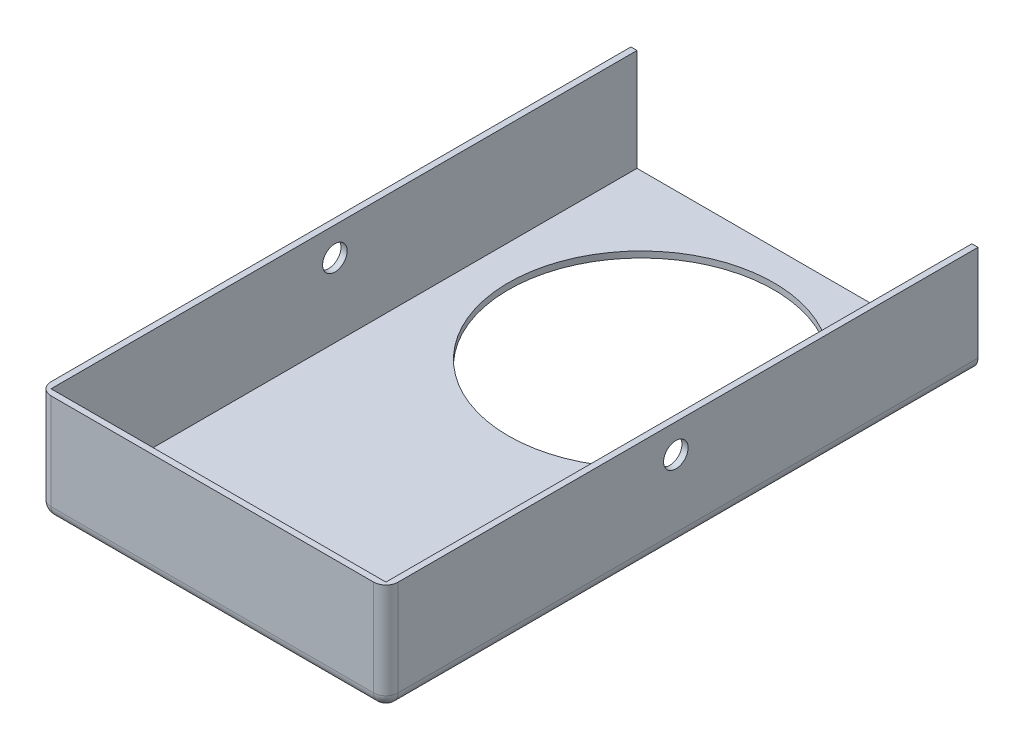
ISO-10303-21;
HEADER;
FILE_DESCRIPTION(('STEP AP214'),'2;1');
FILE_NAME('part.step','',(''),(''),'','','');
FILE_SCHEMA(('AUTOMOTIVE_DESIGN { 1 0 10303 214 1 1 1 1 }'));
ENDSEC;
DATA;
#1=APPLICATION_CONTEXT('core data for automotive mechanical design processes');
#2=APPLICATION_PROTOCOL_DEFINITION('international standard','automotive_design',2000,#1);
#3=PRODUCT_CONTEXT('',#1,'mechanical');
#4=PRODUCT('Part','Part','',(#3));
#5=PRODUCT_RELATED_PRODUCT_CATEGORY('part','',(#4));
#6=PRODUCT_DEFINITION_FORMATION('','',#4);
#7=PRODUCT_DEFINITION_CONTEXT('part definition',#1,'design');
#8=PRODUCT_DEFINITION('design','',#6,#7);
#9=PRODUCT_DEFINITION_SHAPE('','',#8);
#10=(LENGTH_UNIT() NAMED_UNIT(*) SI_UNIT(.MILLI.,.METRE.));
#11=(NAMED_UNIT(*) PLANE_ANGLE_UNIT() SI_UNIT($,.RADIAN.));
#12=(NAMED_UNIT(*) SI_UNIT($,.STERADIAN.) SOLID_ANGLE_UNIT());
#13=UNCERTAINTY_MEASURE_WITH_UNIT(LENGTH_MEASURE(1.E-05),#10,'distance_accuracy_value','');
#14=(GEOMETRIC_REPRESENTATION_CONTEXT(3) GLOBAL_UNCERTAINTY_ASSIGNED_CONTEXT((#13)) GLOBAL_UNIT_ASSIGNED_CONTEXT((#10,
#11,#12)) REPRESENTATION_CONTEXT('',''));
#15=CARTESIAN_POINT('',(0.,0.,0.));
#16=DIRECTION('',(0.,0.,1.));
#17=DIRECTION('',(1.,0.,0.));
#18=AXIS2_PLACEMENT_3D('',#15,#16,#17);
#19=CARTESIAN_POINT('',(0.,1.5,0.));
#20=DIRECTION('',(0.,1.,0.));
#21=DIRECTION('',(0.,0.,1.));
#22=AXIS2_PLACEMENT_3D('',#19,#20,#21);
#23=PLANE('',#22);
#24=CARTESIAN_POINT('',(0.,1.5,54.5));
#25=DIRECTION('',(0.,1.,0.));
#26=DIRECTION('',(0.,0.,1.));
#27=AXIS2_PLACEMENT_3D('',#24,#25,#26);
#28=CIRCLE('',#27,4.5);
#29=CARTESIAN_POINT('',(0.,1.5,59.));
#30=VERTEX_POINT('',#29);
#31=EDGE_CURVE('E11',#30,#30,#28,.F.);
#32=ORIENTED_EDGE('',*,*,#31,.T.);
#33=EDGE_LOOP('',(#32));
#34=FACE_BOUND('',#33,.T.);
#35=CARTESIAN_POINT('',(0.,1.5,-32.5));
#36=DIRECTION('',(0.,1.,0.));
#37=DIRECTION('',(0.,0.,1.));
#38=AXIS2_PLACEMENT_3D('',#35,#36,#37);
#39=CIRCLE('',#38,32.5);
#40=CARTESIAN_POINT('',(0.,1.5,0.));
#41=VERTEX_POINT('',#40);
#42=EDGE_CURVE('E216',#41,#41,#39,.T.);
#43=ORIENTED_EDGE('',*,*,#42,.F.);
#44=EDGE_LOOP('',(#43));
#45=FACE_BOUND('',#44,.T.);
#46=DIRECTION('',(0.,0.,-1.));
#47=VECTOR('',#46,1.);
#48=CARTESIAN_POINT('',(-41.,1.5,0.));
#49=LINE('',#48,#47);
#50=CARTESIAN_POINT('',(-41.,1.5,71.));
#51=VERTEX_POINT('',#50);
#52=CARTESIAN_POINT('',(-41.,1.5,-72.5));
#53=VERTEX_POINT('',#52);
#54=EDGE_CURVE('E197',#51,#53,#49,.T.);
#55=ORIENTED_EDGE('',*,*,#54,.F.);
#56=DIRECTION('',(1.,0.,0.));
#57=VECTOR('',#56,1.);
#58=CARTESIAN_POINT('',(0.,1.5,71.));
#59=LINE('',#58,#57);
#60=CARTESIAN_POINT('',(41.,1.5,71.));
#61=VERTEX_POINT('',#60);
#62=EDGE_CURVE('E192',#51,#61,#59,.T.);
#63=ORIENTED_EDGE('',*,*,#62,.T.);
#64=DIRECTION('',(0.,0.,-1.));
#65=VECTOR('',#64,1.);
#66=CARTESIAN_POINT('',(41.,1.5,0.));
#67=LINE('',#66,#65);
#68=CARTESIAN_POINT('',(41.,1.5,-72.5));
#69=VERTEX_POINT('',#68);
#70=EDGE_CURVE('E188',#61,#69,#67,.T.);
#71=ORIENTED_EDGE('',*,*,#70,.T.);
#72=DIRECTION('',(-1.,0.,0.));
#73=VECTOR('',#72,1.);
#74=CARTESIAN_POINT('',(42.5,1.5,-72.5));
#75=LINE('',#74,#73);
#76=EDGE_CURVE('E224',#69,#53,#75,.T.);
#77=ORIENTED_EDGE('',*,*,#76,.T.);
#78=EDGE_LOOP('',(#55,#63,#71,#77));
#79=FACE_BOUND('',#78,.T.);
#80=ADVANCED_FACE('F45',(#34,#45,#79),#23,.T.);
#81=CARTESIAN_POINT('',(0.,0.,0.));
#82=DIRECTION('',(0.,1.,0.));
#83=DIRECTION('',(0.,0.,1.));
#84=AXIS2_PLACEMENT_3D('',#81,#82,#83);
#85=PLANE('',#84);
#86=DIRECTION('',(1.,0.,0.));
#87=VECTOR('',#86,1.);
#88=CARTESIAN_POINT('',(0.,0.,69.5));
#89=LINE('',#88,#87);
#90=CARTESIAN_POINT('',(39.5,0.,69.5));
#91=VERTEX_POINT('',#90);
#92=CARTESIAN_POINT('',(-39.5,0.,69.5));
#93=VERTEX_POINT('',#92);
#94=EDGE_CURVE('E61',#91,#93,#89,.F.);
#95=ORIENTED_EDGE('',*,*,#94,.T.);
#96=DIRECTION('',(0.,0.,1.));
#97=VECTOR('',#96,1.);
#98=CARTESIAN_POINT('',(-39.5,0.,0.));
#99=LINE('',#98,#97);
#100=CARTESIAN_POINT('',(-39.5,0.,-72.5));
#101=VERTEX_POINT('',#100);
#102=EDGE_CURVE('E267',#93,#101,#99,.F.);
#103=ORIENTED_EDGE('',*,*,#102,.T.);
#104=DIRECTION('',(-1.,0.,0.));
#105=VECTOR('',#104,1.);
#106=CARTESIAN_POINT('',(42.5,0.,-72.5));
#107=LINE('',#106,#105);
#108=CARTESIAN_POINT('',(39.5,0.,-72.5));
#109=VERTEX_POINT('',#108);
#110=EDGE_CURVE('E220',#109,#101,#107,.T.);
#111=ORIENTED_EDGE('',*,*,#110,.F.);
#112=DIRECTION('',(0.,0.,-1.));
#113=VECTOR('',#112,1.);
#114=CARTESIAN_POINT('',(39.5,0.,0.));
#115=LINE('',#114,#113);
#116=EDGE_CURVE('E66',#109,#91,#115,.F.);
#117=ORIENTED_EDGE('',*,*,#116,.T.);
#118=EDGE_LOOP('',(#95,#103,#111,#117));
#119=FACE_BOUND('',#118,.T.);
#120=CARTESIAN_POINT('',(0.,0.,-32.5));
#121=DIRECTION('',(0.,1.,0.));
#122=DIRECTION('',(0.,0.,1.));
#123=AXIS2_PLACEMENT_3D('',#120,#121,#122);
#124=CIRCLE('',#123,32.5);
#125=CARTESIAN_POINT('',(0.,0.,0.));
#126=VERTEX_POINT('',#125);
#127=EDGE_CURVE('E215',#126,#126,#124,.T.);
#128=ORIENTED_EDGE('',*,*,#127,.T.);
#129=EDGE_LOOP('',(#128));
#130=FACE_BOUND('',#129,.T.);
#131=CARTESIAN_POINT('',(0.,0.,54.5));
#132=DIRECTION('',(0.,1.,0.));
#133=DIRECTION('',(0.,0.,1.));
#134=AXIS2_PLACEMENT_3D('',#131,#132,#133);
#135=CIRCLE('',#134,3.);
#136=CARTESIAN_POINT('',(0.,0.,57.5));
#137=VERTEX_POINT('',#136);
#138=EDGE_CURVE('E211',#137,#137,#135,.T.);
#139=ORIENTED_EDGE('',*,*,#138,.T.);
#140=EDGE_LOOP('',(#139));
#141=FACE_BOUND('',#140,.T.);
#142=ADVANCED_FACE('F316',(#119,#130,#141),#85,.F.);
#143=CARTESIAN_POINT('',(-42.5,1.5,72.5));
#144=DIRECTION('',(1.,0.,0.));
#145=DIRECTION('',(0.,0.,-1.));
#146=AXIS2_PLACEMENT_3D('',#143,#144,#145);
#147=PLANE('',#146);
#148=CARTESIAN_POINT('',(-42.5,19.5,1.50000000000002));
#149=DIRECTION('',(1.,0.,0.));
#150=DIRECTION('',(0.,0.,-1.));
#151=AXIS2_PLACEMENT_3D('',#148,#149,#150);
#152=CIRCLE('',#151,3.);
#153=CARTESIAN_POINT('',(-42.5,19.5,-1.49999999999998));
#154=VERTEX_POINT('',#153);
#155=EDGE_CURVE('E237',#154,#154,#152,.T.);
#156=ORIENTED_EDGE('',*,*,#155,.T.);
#157=EDGE_LOOP('',(#156));
#158=FACE_BOUND('',#157,.T.);
#159=DIRECTION('',(0.,0.,1.));
#160=VECTOR('',#159,1.);
#161=CARTESIAN_POINT('',(-42.5,3.,72.5));
#162=LINE('',#161,#160);
#163=CARTESIAN_POINT('',(-42.5,3.,-72.5));
#164=VERTEX_POINT('',#163);
#165=CARTESIAN_POINT('',(-42.5,3.,69.5));
#166=VERTEX_POINT('',#165);
#167=EDGE_CURVE('E257',#164,#166,#162,.T.);
#168=ORIENTED_EDGE('',*,*,#167,.T.);
#169=DIRECTION('',(0.,-1.,0.));
#170=VECTOR('',#169,1.);
#171=CARTESIAN_POINT('',(-42.5,1.5,69.5));
#172=LINE('',#171,#170);
#173=CARTESIAN_POINT('',(-42.5,26.5,69.5));
#174=VERTEX_POINT('',#173);
#175=EDGE_CURVE('E260',#166,#174,#172,.F.);
#176=ORIENTED_EDGE('',*,*,#175,.T.);
#177=DIRECTION('',(0.,0.,1.));
#178=VECTOR('',#177,1.);
#179=CARTESIAN_POINT('',(-42.5,26.5,0.));
#180=LINE('',#179,#178);
#181=CARTESIAN_POINT('',(-42.5,26.5,-72.5));
#182=VERTEX_POINT('',#181);
#183=EDGE_CURVE('E183',#182,#174,#180,.T.);
#184=ORIENTED_EDGE('',*,*,#183,.F.);
#185=DIRECTION('',(0.,-1.,0.));
#186=VECTOR('',#185,1.);
#187=CARTESIAN_POINT('',(-42.5,1.5,-72.5));
#188=LINE('',#187,#186);
#189=EDGE_CURVE('E157',#182,#164,#188,.T.);
#190=ORIENTED_EDGE('',*,*,#189,.T.);
#191=EDGE_LOOP('',(#168,#176,#184,#190));
#192=FACE_BOUND('',#191,.T.);
#193=ADVANCED_FACE('F324',(#158,#192),#147,.F.);
#194=CARTESIAN_POINT('',(42.5,1.5,72.5));
#195=DIRECTION('',(0.,0.,-1.));
#196=DIRECTION('',(-1.,0.,0.));
#197=AXIS2_PLACEMENT_3D('',#194,#195,#196);
#198=PLANE('',#197);
#199=DIRECTION('',(1.,0.,0.));
#200=VECTOR('',#199,1.);
#201=CARTESIAN_POINT('',(42.5,3.,72.5));
#202=LINE('',#201,#200);
#203=CARTESIAN_POINT('',(-39.5,3.,72.5));
#204=VERTEX_POINT('',#203);
#205=CARTESIAN_POINT('',(39.5,3.,72.5));
#206=VERTEX_POINT('',#205);
#207=EDGE_CURVE('E243',#204,#206,#202,.T.);
#208=ORIENTED_EDGE('',*,*,#207,.T.);
#209=DIRECTION('',(0.,-1.,0.));
#210=VECTOR('',#209,1.);
#211=CARTESIAN_POINT('',(39.5,1.5,72.5));
#212=LINE('',#211,#210);
#213=CARTESIAN_POINT('',(39.5,26.5,72.5));
#214=VERTEX_POINT('',#213);
#215=EDGE_CURVE('E249',#206,#214,#212,.F.);
#216=ORIENTED_EDGE('',*,*,#215,.T.);
#217=DIRECTION('',(1.,0.,0.));
#218=VECTOR('',#217,1.);
#219=CARTESIAN_POINT('',(0.,26.5,72.5));
#220=LINE('',#219,#218);
#221=CARTESIAN_POINT('',(-39.5,26.5,72.5));
#222=VERTEX_POINT('',#221);
#223=EDGE_CURVE('E147',#222,#214,#220,.T.);
#224=ORIENTED_EDGE('',*,*,#223,.F.);
#225=DIRECTION('',(0.,-1.,0.));
#226=VECTOR('',#225,1.);
#227=CARTESIAN_POINT('',(-39.5,1.5,72.5));
#228=LINE('',#227,#226);
#229=EDGE_CURVE('E246',#222,#204,#228,.T.);
#230=ORIENTED_EDGE('',*,*,#229,.T.);
#231=EDGE_LOOP('',(#208,#216,#224,#230));
#232=FACE_BOUND('',#231,.T.);
#233=ADVANCED_FACE('F335',(#232),#198,.F.);
#234=CARTESIAN_POINT('',(42.5,1.5,72.5));
#235=DIRECTION('',(-1.,0.,0.));
#236=DIRECTION('',(0.,0.,1.));
#237=AXIS2_PLACEMENT_3D('',#234,#235,#236);
#238=PLANE('',#237);
#239=CARTESIAN_POINT('',(42.5,19.5,1.50000000000002));
#240=DIRECTION('',(1.,0.,0.));
#241=DIRECTION('',(0.,0.,-1.));
#242=AXIS2_PLACEMENT_3D('',#239,#240,#241);
#243=CIRCLE('',#242,3.);
#244=CARTESIAN_POINT('',(42.5,19.5,-1.49999999999998));
#245=VERTEX_POINT('',#244);
#246=EDGE_CURVE('E299',#245,#245,#243,.T.);
#247=ORIENTED_EDGE('',*,*,#246,.F.);
#248=EDGE_LOOP('',(#247));
#249=FACE_BOUND('',#248,.T.);
#250=DIRECTION('',(0.,0.,-1.));
#251=VECTOR('',#250,1.);
#252=CARTESIAN_POINT('',(42.5,26.5,0.));
#253=LINE('',#252,#251);
#254=CARTESIAN_POINT('',(42.5,26.5,69.5));
#255=VERTEX_POINT('',#254);
#256=CARTESIAN_POINT('',(42.5,26.5,-72.5));
#257=VERTEX_POINT('',#256);
#258=EDGE_CURVE('E133',#255,#257,#253,.T.);
#259=ORIENTED_EDGE('',*,*,#258,.F.);
#260=DIRECTION('',(0.,-1.,0.));
#261=VECTOR('',#260,1.);
#262=CARTESIAN_POINT('',(42.5,1.5,69.5));
#263=LINE('',#262,#261);
#264=CARTESIAN_POINT('',(42.5,3.,69.5));
#265=VERTEX_POINT('',#264);
#266=EDGE_CURVE('E240',#255,#265,#263,.T.);
#267=ORIENTED_EDGE('',*,*,#266,.T.);
#268=DIRECTION('',(0.,0.,-1.));
#269=VECTOR('',#268,1.);
#270=CARTESIAN_POINT('',(42.5,3.,72.5));
#271=LINE('',#270,#269);
#272=CARTESIAN_POINT('',(42.5,3.,-72.5));
#273=VERTEX_POINT('',#272);
#274=EDGE_CURVE('E153',#265,#273,#271,.T.);
#275=ORIENTED_EDGE('',*,*,#274,.T.);
#276=DIRECTION('',(0.,-1.,0.));
#277=VECTOR('',#276,1.);
#278=CARTESIAN_POINT('',(42.5,1.5,-72.5));
#279=LINE('',#278,#277);
#280=EDGE_CURVE('E150',#257,#273,#279,.T.);
#281=ORIENTED_EDGE('',*,*,#280,.F.);
#282=EDGE_LOOP('',(#259,#267,#275,#281));
#283=FACE_BOUND('',#282,.T.);
#284=ADVANCED_FACE('F151',(#249,#283),#238,.F.);
#285=CARTESIAN_POINT('',(42.5,1.5,-72.5));
#286=DIRECTION('',(0.,0.,1.));
#287=DIRECTION('',(1.,0.,0.));
#288=AXIS2_PLACEMENT_3D('',#285,#286,#287);
#289=PLANE('',#288);
#290=ORIENTED_EDGE('',*,*,#110,.T.);
#291=CARTESIAN_POINT('',(-39.5,3.,-72.5));
#292=DIRECTION('',(0.,0.,1.));
#293=DIRECTION('',(1.,0.,0.));
#294=AXIS2_PLACEMENT_3D('',#291,#292,#293);
#295=CIRCLE('',#294,3.);
#296=EDGE_CURVE('E273',#101,#164,#295,.F.);
#297=ORIENTED_EDGE('',*,*,#296,.T.);
#298=ORIENTED_EDGE('',*,*,#189,.F.);
#299=DIRECTION('',(-1.,0.,0.));
#300=VECTOR('',#299,1.);
#301=CARTESIAN_POINT('',(0.,26.5,-72.5));
#302=LINE('',#301,#300);
#303=CARTESIAN_POINT('',(-41.,26.5,-72.5));
#304=VERTEX_POINT('',#303);
#305=EDGE_CURVE('E179',#304,#182,#302,.T.);
#306=ORIENTED_EDGE('',*,*,#305,.F.);
#307=DIRECTION('',(0.,-1.,0.));
#308=VECTOR('',#307,1.);
#309=CARTESIAN_POINT('',(-41.,26.5,-72.5));
#310=LINE('',#309,#308);
#311=EDGE_CURVE('E187',#304,#53,#310,.T.);
#312=ORIENTED_EDGE('',*,*,#311,.T.);
#313=ORIENTED_EDGE('',*,*,#76,.F.);
#314=DIRECTION('',(0.,-1.,0.));
#315=VECTOR('',#314,1.);
#316=CARTESIAN_POINT('',(41.,26.5,-72.5));
#317=LINE('',#316,#315);
#318=CARTESIAN_POINT('',(41.,26.5,-72.5));
#319=VERTEX_POINT('',#318);
#320=EDGE_CURVE('E162',#319,#69,#317,.T.);
#321=ORIENTED_EDGE('',*,*,#320,.F.);
#322=DIRECTION('',(-1.,0.,0.));
#323=VECTOR('',#322,1.);
#324=CARTESIAN_POINT('',(0.,26.5,-72.5));
#325=LINE('',#324,#323);
#326=EDGE_CURVE('E139',#257,#319,#325,.T.);
#327=ORIENTED_EDGE('',*,*,#326,.F.);
#328=ORIENTED_EDGE('',*,*,#280,.T.);
#329=CARTESIAN_POINT('',(39.5,3.,-72.5));
#330=DIRECTION('',(0.,0.,1.));
#331=DIRECTION('',(1.,0.,0.));
#332=AXIS2_PLACEMENT_3D('',#329,#330,#331);
#333=CIRCLE('',#332,3.);
#334=EDGE_CURVE('E270',#273,#109,#333,.F.);
#335=ORIENTED_EDGE('',*,*,#334,.T.);
#336=EDGE_LOOP('',(#290,#297,#298,#306,#312,#313,#321,#327,#328,#335));
#337=FACE_BOUND('',#336,.T.);
#338=ADVANCED_FACE('F160',(#337),#289,.F.);
#339=CARTESIAN_POINT('',(0.,1.5,-32.5));
#340=DIRECTION('',(0.,-1.,0.));
#341=DIRECTION('',(0.,0.,-1.));
#342=AXIS2_PLACEMENT_3D('',#339,#340,#341);
#343=CYLINDRICAL_SURFACE('',#342,32.5);
#344=ORIENTED_EDGE('',*,*,#42,.T.);
#345=EDGE_LOOP('',(#344));
#346=FACE_BOUND('',#345,.T.);
#347=ORIENTED_EDGE('',*,*,#127,.F.);
#348=EDGE_LOOP('',(#347));
#349=FACE_BOUND('',#348,.T.);
#350=ADVANCED_FACE('F328',(#346,#349),#343,.F.);
#351=CARTESIAN_POINT('',(0.,1.5,54.5));
#352=DIRECTION('',(0.,-1.,0.));
#353=DIRECTION('',(0.,0.,-1.));
#354=AXIS2_PLACEMENT_3D('',#351,#352,#353);
#355=CYLINDRICAL_SURFACE('',#354,3.);
#356=ORIENTED_EDGE('',*,*,#138,.F.);
#357=EDGE_LOOP('',(#356));
#358=FACE_BOUND('',#357,.T.);
#359=CARTESIAN_POINT('',(0.,4.5,54.5));
#360=DIRECTION('',(0.,1.,0.));
#361=DIRECTION('',(0.,0.,1.));
#362=AXIS2_PLACEMENT_3D('',#359,#360,#361);
#363=CIRCLE('',#362,3.);
#364=CARTESIAN_POINT('',(0.,4.5,57.5));
#365=VERTEX_POINT('',#364);
#366=EDGE_CURVE('E406',#365,#365,#363,.T.);
#367=ORIENTED_EDGE('',*,*,#366,.T.);
#368=EDGE_LOOP('',(#367));
#369=FACE_BOUND('',#368,.T.);
#370=ADVANCED_FACE('F411',(#358,#369),#355,.F.);
#371=CARTESIAN_POINT('',(41.,26.5,0.));
#372=DIRECTION('',(-1.,0.,0.));
#373=DIRECTION('',(0.,0.,1.));
#374=AXIS2_PLACEMENT_3D('',#371,#372,#373);
#375=PLANE('',#374);
#376=CARTESIAN_POINT('',(41.,19.5,1.50000000000002));
#377=DIRECTION('',(-1.,0.,0.));
#378=DIRECTION('',(0.,0.,1.));
#379=AXIS2_PLACEMENT_3D('',#376,#377,#378);
#380=CIRCLE('',#379,3.);
#381=CARTESIAN_POINT('',(41.,19.5,4.50000000000001));
#382=VERTEX_POINT('',#381);
#383=EDGE_CURVE('E193',#382,#382,#380,.T.);
#384=ORIENTED_EDGE('',*,*,#383,.F.);
#385=EDGE_LOOP('',(#384));
#386=FACE_BOUND('',#385,.T.);
#387=ORIENTED_EDGE('',*,*,#70,.F.);
#388=DIRECTION('',(0.,-1.,0.));
#389=VECTOR('',#388,1.);
#390=CARTESIAN_POINT('',(41.,26.5,71.));
#391=LINE('',#390,#389);
#392=CARTESIAN_POINT('',(41.,26.5,71.));
#393=VERTEX_POINT('',#392);
#394=EDGE_CURVE('E206',#393,#61,#391,.T.);
#395=ORIENTED_EDGE('',*,*,#394,.F.);
#396=DIRECTION('',(0.,0.,-1.));
#397=VECTOR('',#396,1.);
#398=CARTESIAN_POINT('',(41.,26.5,0.));
#399=LINE('',#398,#397);
#400=EDGE_CURVE('E165',#393,#319,#399,.T.);
#401=ORIENTED_EDGE('',*,*,#400,.T.);
#402=ORIENTED_EDGE('',*,*,#320,.T.);
#403=EDGE_LOOP('',(#387,#395,#401,#402));
#404=FACE_BOUND('',#403,.T.);
#405=ADVANCED_FACE('F428',(#386,#404),#375,.T.);
#406=CARTESIAN_POINT('',(0.,26.5,71.));
#407=DIRECTION('',(0.,0.,-1.));
#408=DIRECTION('',(-1.,0.,0.));
#409=AXIS2_PLACEMENT_3D('',#406,#407,#408);
#410=PLANE('',#409);
#411=ORIENTED_EDGE('',*,*,#62,.F.);
#412=DIRECTION('',(0.,-1.,0.));
#413=VECTOR('',#412,1.);
#414=CARTESIAN_POINT('',(-41.,26.5,71.));
#415=LINE('',#414,#413);
#416=CARTESIAN_POINT('',(-41.,26.5,71.));
#417=VERTEX_POINT('',#416);
#418=EDGE_CURVE('E203',#417,#51,#415,.T.);
#419=ORIENTED_EDGE('',*,*,#418,.F.);
#420=DIRECTION('',(1.,0.,0.));
#421=VECTOR('',#420,1.);
#422=CARTESIAN_POINT('',(0.,26.5,71.));
#423=LINE('',#422,#421);
#424=EDGE_CURVE('E169',#417,#393,#423,.T.);
#425=ORIENTED_EDGE('',*,*,#424,.T.);
#426=ORIENTED_EDGE('',*,*,#394,.T.);
#427=EDGE_LOOP('',(#411,#419,#425,#426));
#428=FACE_BOUND('',#427,.T.);
#429=ADVANCED_FACE('F424',(#428),#410,.T.);
#430=CARTESIAN_POINT('',(-41.,26.5,0.));
#431=DIRECTION('',(-1.,0.,0.));
#432=DIRECTION('',(0.,0.,1.));
#433=AXIS2_PLACEMENT_3D('',#430,#431,#432);
#434=PLANE('',#433);
#435=CARTESIAN_POINT('',(-41.,19.5,1.50000000000002));
#436=DIRECTION('',(-1.,0.,0.));
#437=DIRECTION('',(0.,0.,1.));
#438=AXIS2_PLACEMENT_3D('',#435,#436,#437);
#439=CIRCLE('',#438,3.);
#440=CARTESIAN_POINT('',(-41.,19.5,4.50000000000001));
#441=VERTEX_POINT('',#440);
#442=EDGE_CURVE('E233',#441,#441,#439,.T.);
#443=ORIENTED_EDGE('',*,*,#442,.T.);
#444=EDGE_LOOP('',(#443));
#445=FACE_BOUND('',#444,.T.);
#446=ORIENTED_EDGE('',*,*,#54,.T.);
#447=ORIENTED_EDGE('',*,*,#311,.F.);
#448=DIRECTION('',(0.,0.,-1.));
#449=VECTOR('',#448,1.);
#450=CARTESIAN_POINT('',(-41.,26.5,0.));
#451=LINE('',#450,#449);
#452=EDGE_CURVE('E176',#417,#304,#451,.T.);
#453=ORIENTED_EDGE('',*,*,#452,.F.);
#454=ORIENTED_EDGE('',*,*,#418,.T.);
#455=EDGE_LOOP('',(#446,#447,#453,#454));
#456=FACE_BOUND('',#455,.T.);
#457=ADVANCED_FACE('F421',(#445,#456),#434,.F.);
#458=CARTESIAN_POINT('',(0.,26.5,0.));
#459=DIRECTION('',(0.,1.,0.));
#460=DIRECTION('',(0.,0.,1.));
#461=AXIS2_PLACEMENT_3D('',#458,#459,#460);
#462=PLANE('',#461);
#463=ORIENTED_EDGE('',*,*,#223,.T.);
#464=CARTESIAN_POINT('',(39.5,26.5,69.5));
#465=DIRECTION('',(0.,1.,0.));
#466=DIRECTION('',(0.,0.,1.));
#467=AXIS2_PLACEMENT_3D('',#464,#465,#466);
#468=CIRCLE('',#467,3.);
#469=EDGE_CURVE('E142',#214,#255,#468,.T.);
#470=ORIENTED_EDGE('',*,*,#469,.T.);
#471=ORIENTED_EDGE('',*,*,#258,.T.);
#472=ORIENTED_EDGE('',*,*,#326,.T.);
#473=ORIENTED_EDGE('',*,*,#400,.F.);
#474=ORIENTED_EDGE('',*,*,#424,.F.);
#475=ORIENTED_EDGE('',*,*,#452,.T.);
#476=ORIENTED_EDGE('',*,*,#305,.T.);
#477=ORIENTED_EDGE('',*,*,#183,.T.);
#478=CARTESIAN_POINT('',(-39.5,26.5,69.5));
#479=DIRECTION('',(0.,1.,0.));
#480=DIRECTION('',(0.,0.,1.));
#481=AXIS2_PLACEMENT_3D('',#478,#479,#480);
#482=CIRCLE('',#481,3.);
#483=EDGE_CURVE('E252',#174,#222,#482,.T.);
#484=ORIENTED_EDGE('',*,*,#483,.T.);
#485=EDGE_LOOP('',(#463,#470,#471,#472,#473,#474,#475,#476,#477,#484));
#486=FACE_BOUND('',#485,.T.);
#487=ADVANCED_FACE('F136',(#486),#462,.T.);
#488=CARTESIAN_POINT('',(-42.5,19.5,1.50000000000002));
#489=DIRECTION('',(1.,0.,0.));
#490=DIRECTION('',(0.,0.,-1.));
#491=AXIS2_PLACEMENT_3D('',#488,#489,#490);
#492=CYLINDRICAL_SURFACE('',#491,3.);
#493=ORIENTED_EDGE('',*,*,#155,.F.);
#494=EDGE_LOOP('',(#493));
#495=FACE_BOUND('',#494,.T.);
#496=ORIENTED_EDGE('',*,*,#442,.F.);
#497=EDGE_LOOP('',(#496));
#498=FACE_BOUND('',#497,.T.);
#499=ADVANCED_FACE('F373',(#495,#498),#492,.F.);
#500=ORIENTED_EDGE('',*,*,#383,.T.);
#501=EDGE_LOOP('',(#500));
#502=FACE_BOUND('',#501,.T.);
#503=ORIENTED_EDGE('',*,*,#246,.T.);
#504=EDGE_LOOP('',(#503));
#505=FACE_BOUND('',#504,.T.);
#506=ADVANCED_FACE('F368',(#502,#505),#492,.F.);
#507=CARTESIAN_POINT('',(-39.5,3.,72.5));
#508=DIRECTION('',(0.,0.,1.));
#509=DIRECTION('',(1.,0.,0.));
#510=AXIS2_PLACEMENT_3D('',#507,#508,#509);
#511=CYLINDRICAL_SURFACE('',#510,3.);
#512=ORIENTED_EDGE('',*,*,#296,.F.);
#513=ORIENTED_EDGE('',*,*,#102,.F.);
#514=CARTESIAN_POINT('',(-39.5,3.,69.5));
#515=DIRECTION('',(0.,0.,1.));
#516=DIRECTION('',(1.,0.,0.));
#517=AXIS2_PLACEMENT_3D('',#514,#515,#516);
#518=CIRCLE('',#517,3.);
#519=EDGE_CURVE('E296',#166,#93,#518,.T.);
#520=ORIENTED_EDGE('',*,*,#519,.F.);
#521=ORIENTED_EDGE('',*,*,#167,.F.);
#522=EDGE_LOOP('',(#512,#513,#520,#521));
#523=FACE_BOUND('',#522,.T.);
#524=ADVANCED_FACE('F365',(#523),#511,.T.);
#525=CARTESIAN_POINT('',(-39.5,1.5,69.5));
#526=DIRECTION('',(0.,-1.,0.));
#527=DIRECTION('',(0.,0.,-1.));
#528=AXIS2_PLACEMENT_3D('',#525,#526,#527);
#529=CYLINDRICAL_SURFACE('',#528,3.);
#530=ORIENTED_EDGE('',*,*,#483,.F.);
#531=ORIENTED_EDGE('',*,*,#175,.F.);
#532=CARTESIAN_POINT('',(-39.5,3.,69.5));
#533=DIRECTION('',(0.,-1.,0.));
#534=DIRECTION('',(0.,0.,-1.));
#535=AXIS2_PLACEMENT_3D('',#532,#533,#534);
#536=CIRCLE('',#535,3.);
#537=EDGE_CURVE('E292',#204,#166,#536,.T.);
#538=ORIENTED_EDGE('',*,*,#537,.F.);
#539=ORIENTED_EDGE('',*,*,#229,.F.);
#540=EDGE_LOOP('',(#530,#531,#538,#539));
#541=FACE_BOUND('',#540,.T.);
#542=ADVANCED_FACE('F362',(#541),#529,.T.);
#543=CARTESIAN_POINT('',(-39.5,3.,69.5));
#544=DIRECTION('',(-1.,0.,0.));
#545=DIRECTION('',(0.,0.,1.));
#546=AXIS2_PLACEMENT_3D('',#543,#544,#545);
#547=SPHERICAL_SURFACE('',#546,3.);
#548=ORIENTED_EDGE('',*,*,#537,.T.);
#549=ORIENTED_EDGE('',*,*,#519,.T.);
#550=CARTESIAN_POINT('',(-39.5,3.,69.5));
#551=DIRECTION('',(-1.,0.,0.));
#552=DIRECTION('',(0.,0.,1.));
#553=AXIS2_PLACEMENT_3D('',#550,#551,#552);
#554=CIRCLE('',#553,3.);
#555=EDGE_CURVE('E288',#204,#93,#554,.F.);
#556=ORIENTED_EDGE('',*,*,#555,.F.);
#557=EDGE_LOOP('',(#548,#549,#556));
#558=FACE_BOUND('',#557,.T.);
#559=ADVANCED_FACE('F358',(#558),#547,.T.);
#560=CARTESIAN_POINT('',(39.5,3.,72.5));
#561=DIRECTION('',(0.,0.,-1.));
#562=DIRECTION('',(-1.,0.,0.));
#563=AXIS2_PLACEMENT_3D('',#560,#561,#562);
#564=CYLINDRICAL_SURFACE('',#563,3.);
#565=ORIENTED_EDGE('',*,*,#334,.F.);
#566=ORIENTED_EDGE('',*,*,#274,.F.);
#567=CARTESIAN_POINT('',(39.5,3.,69.5));
#568=DIRECTION('',(0.,0.,1.));
#569=DIRECTION('',(1.,0.,0.));
#570=AXIS2_PLACEMENT_3D('',#567,#568,#569);
#571=CIRCLE('',#570,3.);
#572=EDGE_CURVE('E284',#91,#265,#571,.T.);
#573=ORIENTED_EDGE('',*,*,#572,.F.);
#574=ORIENTED_EDGE('',*,*,#116,.F.);
#575=EDGE_LOOP('',(#565,#566,#573,#574));
#576=FACE_BOUND('',#575,.T.);
#577=ADVANCED_FACE('F354',(#576),#564,.T.);
#578=CARTESIAN_POINT('',(42.5,3.,69.5));
#579=DIRECTION('',(1.,0.,0.));
#580=DIRECTION('',(0.,0.,-1.));
#581=AXIS2_PLACEMENT_3D('',#578,#579,#580);
#582=CYLINDRICAL_SURFACE('',#581,3.);
#583=ORIENTED_EDGE('',*,*,#555,.T.);
#584=ORIENTED_EDGE('',*,*,#94,.F.);
#585=CARTESIAN_POINT('',(39.5,3.,69.5));
#586=DIRECTION('',(1.,0.,0.));
#587=DIRECTION('',(0.,0.,-1.));
#588=AXIS2_PLACEMENT_3D('',#585,#586,#587);
#589=CIRCLE('',#588,3.);
#590=EDGE_CURVE('E279',#206,#91,#589,.T.);
#591=ORIENTED_EDGE('',*,*,#590,.F.);
#592=ORIENTED_EDGE('',*,*,#207,.F.);
#593=EDGE_LOOP('',(#583,#584,#591,#592));
#594=FACE_BOUND('',#593,.T.);
#595=ADVANCED_FACE('F350',(#594),#582,.T.);
#596=CARTESIAN_POINT('',(39.5,3.,69.5));
#597=DIRECTION('',(0.,-1.,0.));
#598=DIRECTION('',(0.,0.,-1.));
#599=AXIS2_PLACEMENT_3D('',#596,#597,#598);
#600=SPHERICAL_SURFACE('',#599,3.);
#601=ORIENTED_EDGE('',*,*,#590,.T.);
#602=ORIENTED_EDGE('',*,*,#572,.T.);
#603=CARTESIAN_POINT('',(39.5,3.,69.5));
#604=DIRECTION('',(0.,-1.,0.));
#605=DIRECTION('',(0.,0.,-1.));
#606=AXIS2_PLACEMENT_3D('',#603,#604,#605);
#607=CIRCLE('',#606,3.);
#608=EDGE_CURVE('E276',#206,#265,#607,.F.);
#609=ORIENTED_EDGE('',*,*,#608,.F.);
#610=EDGE_LOOP('',(#601,#602,#609));
#611=FACE_BOUND('',#610,.T.);
#612=ADVANCED_FACE('F346',(#611),#600,.T.);
#613=CARTESIAN_POINT('',(39.5,1.5,69.5));
#614=DIRECTION('',(0.,-1.,0.));
#615=DIRECTION('',(0.,0.,-1.));
#616=AXIS2_PLACEMENT_3D('',#613,#614,#615);
#617=CYLINDRICAL_SURFACE('',#616,3.);
#618=ORIENTED_EDGE('',*,*,#469,.F.);
#619=ORIENTED_EDGE('',*,*,#215,.F.);
#620=ORIENTED_EDGE('',*,*,#608,.T.);
#621=ORIENTED_EDGE('',*,*,#266,.F.);
#622=EDGE_LOOP('',(#618,#619,#620,#621));
#623=FACE_BOUND('',#622,.T.);
#624=ADVANCED_FACE('F343',(#623),#617,.T.);
#625=CARTESIAN_POINT('',(0.,4.5,54.5));
#626=DIRECTION('',(0.,1.,0.));
#627=DIRECTION('',(0.,0.,1.));
#628=AXIS2_PLACEMENT_3D('',#625,#626,#627);
#629=PLANE('',#628);
#630=CARTESIAN_POINT('',(0.,4.5,54.5));
#631=DIRECTION('',(0.,1.,0.));
#632=DIRECTION('',(0.,0.,1.));
#633=AXIS2_PLACEMENT_3D('',#630,#631,#632);
#634=CIRCLE('',#633,3.5);
#635=CARTESIAN_POINT('',(0.,4.5,58.));
#636=VERTEX_POINT('',#635);
#637=EDGE_CURVE('E280',#636,#636,#634,.T.);
#638=ORIENTED_EDGE('',*,*,#637,.T.);
#639=EDGE_LOOP('',(#638));
#640=FACE_BOUND('',#639,.T.);
#641=ORIENTED_EDGE('',*,*,#366,.F.);
#642=EDGE_LOOP('',(#641));
#643=FACE_BOUND('',#642,.T.);
#644=ADVANCED_FACE('F312',(#640,#643),#629,.T.);
#645=CARTESIAN_POINT('',(0.,4.5,54.5));
#646=DIRECTION('',(0.,-1.,0.));
#647=DIRECTION('',(0.,0.,-1.));
#648=AXIS2_PLACEMENT_3D('',#645,#646,#647);
#649=CYLINDRICAL_SURFACE('',#648,3.5);
#650=CARTESIAN_POINT('',(0.,2.5,54.5));
#651=DIRECTION('',(0.,1.,0.));
#652=DIRECTION('',(0.,0.,1.));
#653=AXIS2_PLACEMENT_3D('',#650,#651,#652);
#654=CIRCLE('',#653,3.5);
#655=CARTESIAN_POINT('',(0.,2.5,58.));
#656=VERTEX_POINT('',#655);
#657=EDGE_CURVE('E54',#656,#656,#654,.T.);
#658=ORIENTED_EDGE('',*,*,#657,.T.);
#659=EDGE_LOOP('',(#658));
#660=FACE_BOUND('',#659,.T.);
#661=ORIENTED_EDGE('',*,*,#637,.F.);
#662=EDGE_LOOP('',(#661));
#663=FACE_BOUND('',#662,.T.);
#664=ADVANCED_FACE('F304',(#660,#663),#649,.T.);
#665=CARTESIAN_POINT('',(0.,2.5,54.5));
#666=DIRECTION('',(0.,1.,0.));
#667=DIRECTION('',(0.,0.,1.));
#668=AXIS2_PLACEMENT_3D('',#665,#666,#667);
#669=TOROIDAL_SURFACE('',#668,4.5,1.);
#670=ORIENTED_EDGE('',*,*,#31,.F.);
#671=EDGE_LOOP('',(#670));
#672=FACE_BOUND('',#671,.T.);
#673=ORIENTED_EDGE('',*,*,#657,.F.);
#674=EDGE_LOOP('',(#673));
#675=FACE_BOUND('',#674,.T.);
#676=ADVANCED_FACE('F47',(#672,#675),#669,.F.);
#677=CLOSED_SHELL('',(#80,#142,#193,#233,#284,#338,#350,#370,#405,#429,#457,#487,#499,#506,#524,
#542,#559,#577,#595,#612,#624,#644,#664,#676));
#678=MANIFOLD_SOLID_BREP('B2',#677);
#679=ADVANCED_BREP_SHAPE_REPRESENTATION('',(#18,#678),#14);
#680=SHAPE_DEFINITION_REPRESENTATION(#9,#679);
ENDSEC;
END-ISO-10303-21;
